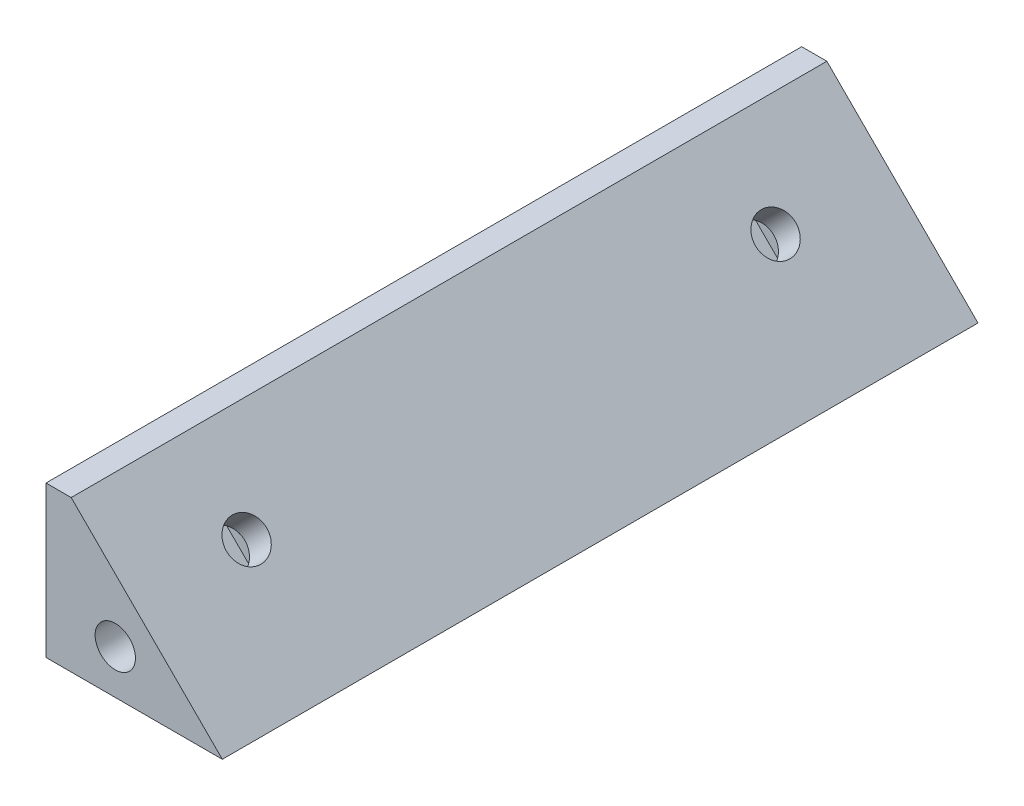
ISO-10303-21;
HEADER;
FILE_DESCRIPTION(('STEP AP214'),'2;1');
FILE_NAME('part.step','',(''),(''),'','','');
FILE_SCHEMA(('AUTOMOTIVE_DESIGN { 1 0 10303 214 1 1 1 1 }'));
ENDSEC;
DATA;
#1=APPLICATION_CONTEXT('core data for automotive mechanical design processes');
#2=APPLICATION_PROTOCOL_DEFINITION('international standard','automotive_design',2000,#1);
#3=PRODUCT_CONTEXT('',#1,'mechanical');
#4=PRODUCT('Part','Part','',(#3));
#5=PRODUCT_RELATED_PRODUCT_CATEGORY('part','',(#4));
#6=PRODUCT_DEFINITION_FORMATION('','',#4);
#7=PRODUCT_DEFINITION_CONTEXT('part definition',#1,'design');
#8=PRODUCT_DEFINITION('design','',#6,#7);
#9=PRODUCT_DEFINITION_SHAPE('','',#8);
#10=(LENGTH_UNIT() NAMED_UNIT(*) SI_UNIT(.MILLI.,.METRE.));
#11=(NAMED_UNIT(*) PLANE_ANGLE_UNIT() SI_UNIT($,.RADIAN.));
#12=(NAMED_UNIT(*) SI_UNIT($,.STERADIAN.) SOLID_ANGLE_UNIT());
#13=UNCERTAINTY_MEASURE_WITH_UNIT(LENGTH_MEASURE(1.E-05),#10,'distance_accuracy_value','');
#14=(GEOMETRIC_REPRESENTATION_CONTEXT(3) GLOBAL_UNCERTAINTY_ASSIGNED_CONTEXT((#13)) GLOBAL_UNIT_ASSIGNED_CONTEXT((#10,
#11,#12)) REPRESENTATION_CONTEXT('',''));
#15=CARTESIAN_POINT('',(0.,0.,0.));
#16=DIRECTION('',(0.,0.,1.));
#17=DIRECTION('',(1.,0.,0.));
#18=AXIS2_PLACEMENT_3D('',#15,#16,#17);
#19=CARTESIAN_POINT('',(4.26758838609296,4.26758838609296,0.));
#20=DIRECTION('',(0.707106781186548,0.707106781186547,0.));
#21=DIRECTION('',(-0.707106781186547,0.707106781186548,0.));
#22=AXIS2_PLACEMENT_3D('',#19,#20,#21);
#23=PLANE('',#22);
#24=CARTESIAN_POINT('',(3.19652057422748,5.33865619795844,9.));
#25=DIRECTION('',(0.707106781186548,0.707106781186547,0.));
#26=DIRECTION('',(-0.707106781186547,0.707106781186548,0.));
#27=AXIS2_PLACEMENT_3D('',#24,#25,#26);
#28=CIRCLE('',#27,1.6);
#29=CARTESIAN_POINT('',(2.06514972432901,6.47002704785692,9.));
#30=VERTEX_POINT('',#29);
#31=EDGE_CURVE('E362',#30,#30,#28,.T.);
#32=ORIENTED_EDGE('',*,*,#31,.T.);
#33=EDGE_LOOP('',(#32));
#34=FACE_BOUND('',#33,.T.);
#35=DIRECTION('',(-0.707106781186547,0.707106781186548,0.));
#36=VECTOR('',#35,1.);
#37=CARTESIAN_POINT('',(4.26758838609296,4.26758838609296,6.175));
#38=LINE('',#37,#36);
#39=CARTESIAN_POINT('',(8.53517677218592,0.,6.175));
#40=VERTEX_POINT('',#39);
#41=CARTESIAN_POINT('',(2.04321915366707,6.49195761851885,6.175));
#42=VERTEX_POINT('',#41);
#43=EDGE_CURVE('E373',#40,#42,#38,.T.);
#44=ORIENTED_EDGE('',*,*,#43,.F.);
#45=DIRECTION('',(0.,0.,1.));
#46=VECTOR('',#45,1.);
#47=CARTESIAN_POINT('',(8.53517677218592,0.,0.));
#48=LINE('',#47,#46);
#49=CARTESIAN_POINT('',(8.53517677218592,0.,11.825));
#50=VERTEX_POINT('',#49);
#51=EDGE_CURVE('E613',#40,#50,#48,.T.);
#52=ORIENTED_EDGE('',*,*,#51,.T.);
#53=DIRECTION('',(-0.707106781186547,0.707106781186548,0.));
#54=VECTOR('',#53,1.);
#55=CARTESIAN_POINT('',(4.26758838609296,4.26758838609296,11.825));
#56=LINE('',#55,#54);
#57=CARTESIAN_POINT('',(2.04321915366707,6.49195761851886,11.825));
#58=VERTEX_POINT('',#57);
#59=EDGE_CURVE('E370',#50,#58,#56,.T.);
#60=ORIENTED_EDGE('',*,*,#59,.T.);
#61=DIRECTION('',(-0.353553390593274,0.353553390593274,-0.866025403784439));
#62=VECTOR('',#61,1.);
#63=CARTESIAN_POINT('',(-1.02134056427785,9.55651733646377,4.31839240474743));
#64=LINE('',#63,#62);
#65=CARTESIAN_POINT('',(0.889917733106655,7.64525903907927,9.00000000000001));
#66=VERTEX_POINT('',#65);
#67=EDGE_CURVE('E365',#58,#66,#64,.T.);
#68=ORIENTED_EDGE('',*,*,#67,.T.);
#69=DIRECTION('',(0.353553390593273,-0.353553390593274,-0.866025403784439));
#70=VECTOR('',#69,1.);
#71=CARTESIAN_POINT('',(4.49001135698431,4.04516541520162,0.181607595252568));
#72=LINE('',#71,#70);
#73=EDGE_CURVE('E417',#66,#42,#72,.T.);
#74=ORIENTED_EDGE('',*,*,#73,.T.);
#75=EDGE_LOOP('',(#44,#52,#60,#68,#74));
#76=FACE_BOUND('',#75,.T.);
#77=ADVANCED_FACE('F124',(#34,#76),#23,.F.);
#78=CARTESIAN_POINT('',(0.,0.,30.));
#79=DIRECTION('',(0.,1.,0.));
#80=DIRECTION('',(0.,0.,1.));
#81=AXIS2_PLACEMENT_3D('',#78,#79,#80);
#82=PLANE('',#81);
#83=DIRECTION('',(0.,0.,-1.));
#84=VECTOR('',#83,1.);
#85=CARTESIAN_POINT('',(10.6693372220188,0.,5.));
#86=LINE('',#85,#84);
#87=CARTESIAN_POINT('',(10.6693372220189,0.,5.));
#88=VERTEX_POINT('',#87);
#89=CARTESIAN_POINT('',(10.6693372220188,0.,2.45));
#90=VERTEX_POINT('',#89);
#91=EDGE_CURVE('E355',#88,#90,#86,.T.);
#92=ORIENTED_EDGE('',*,*,#91,.T.);
#93=DIRECTION('',(1.,0.,0.));
#94=VECTOR('',#93,1.);
#95=CARTESIAN_POINT('',(0.,0.,2.45));
#96=LINE('',#95,#94);
#97=CARTESIAN_POINT('',(2.91347758001106,0.,2.45));
#98=VERTEX_POINT('',#97);
#99=EDGE_CURVE('E325',#98,#90,#96,.T.);
#100=ORIENTED_EDGE('',*,*,#99,.F.);
#101=DIRECTION('',(0.,0.,-1.));
#102=VECTOR('',#101,1.);
#103=CARTESIAN_POINT('',(2.91347758001106,0.,5.));
#104=LINE('',#103,#102);
#105=CARTESIAN_POINT('',(2.91347758001106,0.,5.));
#106=VERTEX_POINT('',#105);
#107=EDGE_CURVE('E358',#106,#98,#104,.T.);
#108=ORIENTED_EDGE('',*,*,#107,.F.);
#109=DIRECTION('',(1.,0.,0.));
#110=VECTOR('',#109,1.);
#111=CARTESIAN_POINT('',(0.,0.,5.));
#112=LINE('',#111,#110);
#113=EDGE_CURVE('E338',#106,#88,#112,.T.);
#114=ORIENTED_EDGE('',*,*,#113,.T.);
#115=EDGE_LOOP('',(#92,#100,#108,#114));
#116=FACE_BOUND('',#115,.T.);
#117=DIRECTION('',(1.,0.,0.));
#118=VECTOR('',#117,1.);
#119=CARTESIAN_POINT('',(0.,0.,0.));
#120=LINE('',#119,#118);
#121=CARTESIAN_POINT('',(-2.,0.,0.));
#122=VERTEX_POINT('',#121);
#123=CARTESIAN_POINT('',(12.,0.,0.));
#124=VERTEX_POINT('',#123);
#125=EDGE_CURVE('E305',#122,#124,#120,.T.);
#126=ORIENTED_EDGE('',*,*,#125,.T.);
#127=DIRECTION('',(0.,0.,-1.));
#128=VECTOR('',#127,1.);
#129=CARTESIAN_POINT('',(12.,0.,30.));
#130=LINE('',#129,#128);
#131=CARTESIAN_POINT('',(12.,0.,60.));
#132=VERTEX_POINT('',#131);
#133=EDGE_CURVE('E303',#132,#124,#130,.T.);
#134=ORIENTED_EDGE('',*,*,#133,.F.);
#135=DIRECTION('',(1.,0.,0.));
#136=VECTOR('',#135,1.);
#137=CARTESIAN_POINT('',(0.,0.,60.));
#138=LINE('',#137,#136);
#139=CARTESIAN_POINT('',(-2.,0.,60.));
#140=VERTEX_POINT('',#139);
#141=EDGE_CURVE('E288',#140,#132,#138,.T.);
#142=ORIENTED_EDGE('',*,*,#141,.F.);
#143=DIRECTION('',(0.,0.,-1.));
#144=VECTOR('',#143,1.);
#145=CARTESIAN_POINT('',(-2.,0.,30.));
#146=LINE('',#145,#144);
#147=EDGE_CURVE('E402',#140,#122,#146,.T.);
#148=ORIENTED_EDGE('',*,*,#147,.T.);
#149=EDGE_LOOP('',(#126,#134,#142,#148));
#150=FACE_BOUND('',#149,.T.);
#151=DIRECTION('',(1.,0.,0.));
#152=VECTOR('',#151,1.);
#153=CARTESIAN_POINT('',(0.,0.,11.825));
#154=LINE('',#153,#152);
#155=CARTESIAN_POINT('',(4.92893218813453,0.,11.825));
#156=VERTEX_POINT('',#155);
#157=EDGE_CURVE('E391',#156,#50,#154,.T.);
#158=ORIENTED_EDGE('',*,*,#157,.T.);
#159=ORIENTED_EDGE('',*,*,#51,.F.);
#160=DIRECTION('',(1.,0.,0.));
#161=VECTOR('',#160,1.);
#162=CARTESIAN_POINT('',(0.,0.,6.175));
#163=LINE('',#162,#161);
#164=CARTESIAN_POINT('',(4.92893218813453,0.,6.175));
#165=VERTEX_POINT('',#164);
#166=EDGE_CURVE('E399',#165,#40,#163,.T.);
#167=ORIENTED_EDGE('',*,*,#166,.F.);
#168=DIRECTION('',(0.,0.,-1.));
#169=VECTOR('',#168,1.);
#170=CARTESIAN_POINT('',(4.92893218813453,0.,30.));
#171=LINE('',#170,#169);
#172=EDGE_CURVE('E309',#156,#165,#171,.T.);
#173=ORIENTED_EDGE('',*,*,#172,.F.);
#174=EDGE_LOOP('',(#158,#159,#167,#173));
#175=FACE_BOUND('',#174,.T.);
#176=DIRECTION('',(1.,0.,0.));
#177=VECTOR('',#176,1.);
#178=CARTESIAN_POINT('',(0.,0.,53.825));
#179=LINE('',#178,#177);
#180=CARTESIAN_POINT('',(4.92893218813453,0.,53.825));
#181=VERTEX_POINT('',#180);
#182=CARTESIAN_POINT('',(8.53517677218592,0.,53.825));
#183=VERTEX_POINT('',#182);
#184=EDGE_CURVE('E446',#181,#183,#179,.T.);
#185=ORIENTED_EDGE('',*,*,#184,.T.);
#186=CARTESIAN_POINT('',(8.53517677218592,0.,48.175));
#187=VERTEX_POINT('',#186);
#188=EDGE_CURVE('E444',#187,#183,#48,.T.);
#189=ORIENTED_EDGE('',*,*,#188,.F.);
#190=DIRECTION('',(1.,0.,0.));
#191=VECTOR('',#190,1.);
#192=CARTESIAN_POINT('',(0.,0.,48.175));
#193=LINE('',#192,#191);
#194=CARTESIAN_POINT('',(4.92893218813453,0.,48.175));
#195=VERTEX_POINT('',#194);
#196=EDGE_CURVE('E438',#195,#187,#193,.T.);
#197=ORIENTED_EDGE('',*,*,#196,.F.);
#198=DIRECTION('',(0.,0.,-1.));
#199=VECTOR('',#198,1.);
#200=CARTESIAN_POINT('',(4.92893218813453,0.,30.));
#201=LINE('',#200,#199);
#202=EDGE_CURVE('E132',#181,#195,#201,.T.);
#203=ORIENTED_EDGE('',*,*,#202,.F.);
#204=EDGE_LOOP('',(#185,#189,#197,#203));
#205=FACE_BOUND('',#204,.T.);
#206=DIRECTION('',(1.,0.,0.));
#207=VECTOR('',#206,1.);
#208=CARTESIAN_POINT('',(0.,0.,55.));
#209=LINE('',#208,#207);
#210=CARTESIAN_POINT('',(2.91347758001106,0.,55.));
#211=VERTEX_POINT('',#210);
#212=CARTESIAN_POINT('',(10.6693372220189,0.,55.));
#213=VERTEX_POINT('',#212);
#214=EDGE_CURVE('E625',#211,#213,#209,.T.);
#215=ORIENTED_EDGE('',*,*,#214,.F.);
#216=DIRECTION('',(0.,0.,1.));
#217=VECTOR('',#216,1.);
#218=CARTESIAN_POINT('',(2.91347758001106,0.,55.));
#219=LINE('',#218,#217);
#220=CARTESIAN_POINT('',(2.91347758001106,0.,57.55));
#221=VERTEX_POINT('',#220);
#222=EDGE_CURVE('E628',#211,#221,#219,.T.);
#223=ORIENTED_EDGE('',*,*,#222,.T.);
#224=DIRECTION('',(1.,0.,0.));
#225=VECTOR('',#224,1.);
#226=CARTESIAN_POINT('',(0.,0.,57.55));
#227=LINE('',#226,#225);
#228=CARTESIAN_POINT('',(10.6693372220188,0.,57.55));
#229=VERTEX_POINT('',#228);
#230=EDGE_CURVE('E598',#221,#229,#227,.T.);
#231=ORIENTED_EDGE('',*,*,#230,.T.);
#232=DIRECTION('',(0.,0.,1.));
#233=VECTOR('',#232,1.);
#234=CARTESIAN_POINT('',(10.6693372220188,0.,55.));
#235=LINE('',#234,#233);
#236=EDGE_CURVE('E630',#213,#229,#235,.T.);
#237=ORIENTED_EDGE('',*,*,#236,.F.);
#238=EDGE_LOOP('',(#215,#223,#231,#237));
#239=FACE_BOUND('',#238,.T.);
#240=ADVANCED_FACE('F126',(#116,#150,#175,#205,#239),#82,.F.);
#241=CARTESIAN_POINT('',(2.46446609406727,2.46446609406727,53.825));
#242=DIRECTION('',(0.,0.,1.));
#243=DIRECTION('',(0.,-1.,0.));
#244=AXIS2_PLACEMENT_3D('',#241,#242,#243);
#245=PLANE('',#244);
#246=DIRECTION('',(-0.707106781186547,0.707106781186548,0.));
#247=VECTOR('',#246,1.);
#248=CARTESIAN_POINT('',(4.26758838609296,4.26758838609296,53.825));
#249=LINE('',#248,#247);
#250=CARTESIAN_POINT('',(2.04321915366707,6.49195761851885,53.825));
#251=VERTEX_POINT('',#250);
#252=EDGE_CURVE('E527',#183,#251,#249,.T.);
#253=ORIENTED_EDGE('',*,*,#252,.F.);
#254=ORIENTED_EDGE('',*,*,#184,.F.);
#255=DIRECTION('',(0.707106781186547,-0.707106781186548,0.));
#256=VECTOR('',#255,1.);
#257=CARTESIAN_POINT('',(2.46446609406727,2.46446609406727,53.825));
#258=LINE('',#257,#256);
#259=CARTESIAN_POINT('',(0.240096861641371,4.68883532649316,53.825));
#260=VERTEX_POINT('',#259);
#261=EDGE_CURVE('E429',#260,#181,#258,.T.);
#262=ORIENTED_EDGE('',*,*,#261,.F.);
#263=DIRECTION('',(0.707106781186548,0.707106781186547,0.));
#264=VECTOR('',#263,1.);
#265=CARTESIAN_POINT('',(0.240096861641371,4.68883532649316,53.825));
#266=LINE('',#265,#264);
#267=EDGE_CURVE('E447',#260,#251,#266,.T.);
#268=ORIENTED_EDGE('',*,*,#267,.T.);
#269=EDGE_LOOP('',(#253,#254,#262,#268));
#270=FACE_BOUND('',#269,.T.);
#271=ADVANCED_FACE('F492',(#270),#245,.F.);
#272=CARTESIAN_POINT('',(2.46446609406727,2.46446609406727,48.175));
#273=DIRECTION('',(0.,0.,1.));
#274=DIRECTION('',(1.,0.,0.));
#275=AXIS2_PLACEMENT_3D('',#272,#273,#274);
#276=PLANE('',#275);
#277=ORIENTED_EDGE('',*,*,#196,.T.);
#278=DIRECTION('',(-0.707106781186547,0.707106781186548,0.));
#279=VECTOR('',#278,1.);
#280=CARTESIAN_POINT('',(4.26758838609296,4.26758838609296,48.175));
#281=LINE('',#280,#279);
#282=CARTESIAN_POINT('',(2.04321915366707,6.49195761851886,48.175));
#283=VERTEX_POINT('',#282);
#284=EDGE_CURVE('E510',#187,#283,#281,.T.);
#285=ORIENTED_EDGE('',*,*,#284,.T.);
#286=DIRECTION('',(0.707106781186548,0.707106781186547,0.));
#287=VECTOR('',#286,1.);
#288=CARTESIAN_POINT('',(0.240096861641371,4.68883532649316,48.175));
#289=LINE('',#288,#287);
#290=CARTESIAN_POINT('',(0.240096861641371,4.68883532649316,48.175));
#291=VERTEX_POINT('',#290);
#292=EDGE_CURVE('E440',#291,#283,#289,.T.);
#293=ORIENTED_EDGE('',*,*,#292,.F.);
#294=DIRECTION('',(0.707106781186547,-0.707106781186548,0.));
#295=VECTOR('',#294,1.);
#296=CARTESIAN_POINT('',(2.46446609406727,2.46446609406727,48.175));
#297=LINE('',#296,#295);
#298=EDGE_CURVE('E426',#291,#195,#297,.T.);
#299=ORIENTED_EDGE('',*,*,#298,.T.);
#300=EDGE_LOOP('',(#277,#285,#293,#299));
#301=FACE_BOUND('',#300,.T.);
#302=ADVANCED_FACE('F436',(#301),#276,.T.);
#303=CARTESIAN_POINT('',(2.68688906495861,2.24204312317592,59.8183924047474));
#304=DIRECTION('',(0.612372435695795,-0.612372435695795,-0.5));
#305=DIRECTION('',(0.707106781186548,0.707106781186547,0.));
#306=AXIS2_PLACEMENT_3D('',#303,#304,#305);
#307=PLANE('',#306);
#308=DIRECTION('',(0.707106781186548,0.707106781186547,0.));
#309=VECTOR('',#308,1.);
#310=CARTESIAN_POINT('',(-0.913204558919042,5.84213674705358,51.));
#311=LINE('',#310,#309);
#312=CARTESIAN_POINT('',(-0.913204558919042,5.84213674705358,51.));
#313=VERTEX_POINT('',#312);
#314=CARTESIAN_POINT('',(0.889917733106652,7.64525903907927,51.));
#315=VERTEX_POINT('',#314);
#316=EDGE_CURVE('E451',#313,#315,#311,.T.);
#317=ORIENTED_EDGE('',*,*,#316,.T.);
#318=DIRECTION('',(0.353553390593273,-0.353553390593274,0.866025403784439));
#319=VECTOR('',#318,1.);
#320=CARTESIAN_POINT('',(4.49001135698431,4.04516541520162,59.8183924047474));
#321=LINE('',#320,#319);
#322=EDGE_CURVE('E515',#315,#251,#321,.T.);
#323=ORIENTED_EDGE('',*,*,#322,.T.);
#324=ORIENTED_EDGE('',*,*,#267,.F.);
#325=DIRECTION('',(-0.353553390593273,0.353553390593274,-0.866025403784439));
#326=VECTOR('',#325,1.);
#327=CARTESIAN_POINT('',(2.68688906495861,2.24204312317592,59.8183924047474));
#328=LINE('',#327,#326);
#329=EDGE_CURVE('E531',#260,#313,#328,.T.);
#330=ORIENTED_EDGE('',*,*,#329,.T.);
#331=EDGE_LOOP('',(#317,#323,#324,#330));
#332=FACE_BOUND('',#331,.T.);
#333=ADVANCED_FACE('F538',(#332),#307,.T.);
#334=CARTESIAN_POINT('',(-2.82446285630354,7.75339504443808,55.6816075952526));
#335=DIRECTION('',(0.612372435695794,-0.612372435695795,0.5));
#336=DIRECTION('',(0.707106781186548,0.707106781186547,0.));
#337=AXIS2_PLACEMENT_3D('',#334,#335,#336);
#338=PLANE('',#337);
#339=ORIENTED_EDGE('',*,*,#292,.T.);
#340=DIRECTION('',(-0.353553390593274,0.353553390593274,0.866025403784439));
#341=VECTOR('',#340,1.);
#342=CARTESIAN_POINT('',(-1.02134056427785,9.55651733646377,55.6816075952526));
#343=LINE('',#342,#341);
#344=EDGE_CURVE('E12',#283,#315,#343,.T.);
#345=ORIENTED_EDGE('',*,*,#344,.T.);
#346=ORIENTED_EDGE('',*,*,#316,.F.);
#347=DIRECTION('',(0.353553390593274,-0.353553390593274,-0.866025403784439));
#348=VECTOR('',#347,1.);
#349=CARTESIAN_POINT('',(-2.82446285630354,7.75339504443808,55.6816075952526));
#350=LINE('',#349,#348);
#351=EDGE_CURVE('E441',#313,#291,#350,.T.);
#352=ORIENTED_EDGE('',*,*,#351,.T.);
#353=EDGE_LOOP('',(#339,#345,#346,#352));
#354=FACE_BOUND('',#353,.T.);
#355=ADVANCED_FACE('F466',(#354),#338,.T.);
#356=CARTESIAN_POINT('',(0.,0.,0.));
#357=DIRECTION('',(0.,0.,1.));
#358=DIRECTION('',(1.,0.,0.));
#359=AXIS2_PLACEMENT_3D('',#356,#357,#358);
#360=PLANE('',#359);
#361=DIRECTION('',(0.707106781186548,-0.707106781186548,0.));
#362=VECTOR('',#361,1.);
#363=CARTESIAN_POINT('',(6.,6.,0.));
#364=LINE('',#363,#362);
#365=CARTESIAN_POINT('',(0.,12.,0.));
#366=VERTEX_POINT('',#365);
#367=EDGE_CURVE('E413',#366,#124,#364,.T.);
#368=ORIENTED_EDGE('',*,*,#367,.T.);
#369=ORIENTED_EDGE('',*,*,#125,.F.);
#370=DIRECTION('',(0.,1.,0.));
#371=VECTOR('',#370,1.);
#372=CARTESIAN_POINT('',(-2.,0.,0.));
#373=LINE('',#372,#371);
#374=CARTESIAN_POINT('',(-2.,12.,0.));
#375=VERTEX_POINT('',#374);
#376=EDGE_CURVE('E403',#122,#375,#373,.T.);
#377=ORIENTED_EDGE('',*,*,#376,.T.);
#378=DIRECTION('',(-1.,0.,0.));
#379=VECTOR('',#378,1.);
#380=CARTESIAN_POINT('',(0.,12.,0.));
#381=LINE('',#380,#379);
#382=EDGE_CURVE('E406',#366,#375,#381,.T.);
#383=ORIENTED_EDGE('',*,*,#382,.F.);
#384=EDGE_LOOP('',(#368,#369,#377,#383));
#385=FACE_BOUND('',#384,.T.);
#386=CARTESIAN_POINT('',(3.5,3.5,0.));
#387=DIRECTION('',(0.,0.,1.));
#388=DIRECTION('',(1.,0.,0.));
#389=AXIS2_PLACEMENT_3D('',#386,#387,#388);
#390=CIRCLE('',#389,1.6);
#391=CARTESIAN_POINT('',(5.1,3.5,0.));
#392=VERTEX_POINT('',#391);
#393=EDGE_CURVE('E300',#392,#392,#390,.T.);
#394=ORIENTED_EDGE('',*,*,#393,.T.);
#395=EDGE_LOOP('',(#394));
#396=FACE_BOUND('',#395,.T.);
#397=ADVANCED_FACE('F462',(#385,#396),#360,.F.);
#398=CARTESIAN_POINT('',(2.46446609406727,2.46446609406727,6.175));
#399=DIRECTION('',(0.,0.,1.));
#400=DIRECTION('',(0.,-1.,0.));
#401=AXIS2_PLACEMENT_3D('',#398,#399,#400);
#402=PLANE('',#401);
#403=ORIENTED_EDGE('',*,*,#166,.T.);
#404=ORIENTED_EDGE('',*,*,#43,.T.);
#405=DIRECTION('',(0.707106781186548,0.707106781186547,0.));
#406=VECTOR('',#405,1.);
#407=CARTESIAN_POINT('',(0.240096861641371,4.68883532649316,6.175));
#408=LINE('',#407,#406);
#409=CARTESIAN_POINT('',(0.240096861641371,4.68883532649316,6.175));
#410=VERTEX_POINT('',#409);
#411=EDGE_CURVE('E387',#410,#42,#408,.T.);
#412=ORIENTED_EDGE('',*,*,#411,.F.);
#413=DIRECTION('',(0.707106781186547,-0.707106781186548,0.));
#414=VECTOR('',#413,1.);
#415=CARTESIAN_POINT('',(2.46446609406727,2.46446609406727,6.175));
#416=LINE('',#415,#414);
#417=EDGE_CURVE('E375',#410,#165,#416,.T.);
#418=ORIENTED_EDGE('',*,*,#417,.T.);
#419=EDGE_LOOP('',(#403,#404,#412,#418));
#420=FACE_BOUND('',#419,.T.);
#421=ADVANCED_FACE('F465',(#420),#402,.T.);
#422=CARTESIAN_POINT('',(2.46446609406727,2.46446609406727,11.825));
#423=DIRECTION('',(0.,0.,1.));
#424=DIRECTION('',(1.,0.,0.));
#425=AXIS2_PLACEMENT_3D('',#422,#423,#424);
#426=PLANE('',#425);
#427=ORIENTED_EDGE('',*,*,#59,.F.);
#428=ORIENTED_EDGE('',*,*,#157,.F.);
#429=DIRECTION('',(0.707106781186547,-0.707106781186548,0.));
#430=VECTOR('',#429,1.);
#431=CARTESIAN_POINT('',(2.46446609406727,2.46446609406727,11.825));
#432=LINE('',#431,#430);
#433=CARTESIAN_POINT('',(0.240096861641371,4.68883532649316,11.825));
#434=VERTEX_POINT('',#433);
#435=EDGE_CURVE('E384',#434,#156,#432,.T.);
#436=ORIENTED_EDGE('',*,*,#435,.F.);
#437=DIRECTION('',(0.707106781186548,0.707106781186547,0.));
#438=VECTOR('',#437,1.);
#439=CARTESIAN_POINT('',(0.240096861641371,4.68883532649316,11.825));
#440=LINE('',#439,#438);
#441=EDGE_CURVE('E388',#434,#58,#440,.T.);
#442=ORIENTED_EDGE('',*,*,#441,.T.);
#443=EDGE_LOOP('',(#427,#428,#436,#442));
#444=FACE_BOUND('',#443,.T.);
#445=ADVANCED_FACE('F646',(#444),#426,.F.);
#446=CARTESIAN_POINT('',(-2.82446285630354,7.75339504443808,4.31839240474743));
#447=DIRECTION('',(-0.612372435695794,0.612372435695795,0.5));
#448=DIRECTION('',(-0.707106781186548,-0.707106781186547,0.));
#449=AXIS2_PLACEMENT_3D('',#446,#447,#448);
#450=PLANE('',#449);
#451=ORIENTED_EDGE('',*,*,#67,.F.);
#452=ORIENTED_EDGE('',*,*,#441,.F.);
#453=DIRECTION('',(0.353553390593274,-0.353553390593274,0.866025403784439));
#454=VECTOR('',#453,1.);
#455=CARTESIAN_POINT('',(-2.82446285630354,7.75339504443808,4.31839240474743));
#456=LINE('',#455,#454);
#457=CARTESIAN_POINT('',(-0.913204558919042,5.84213674705358,9.));
#458=VERTEX_POINT('',#457);
#459=EDGE_CURVE('E381',#458,#434,#456,.T.);
#460=ORIENTED_EDGE('',*,*,#459,.F.);
#461=DIRECTION('',(0.707106781186548,0.707106781186547,0.));
#462=VECTOR('',#461,1.);
#463=CARTESIAN_POINT('',(-0.913204558919042,5.84213674705358,9.));
#464=LINE('',#463,#462);
#465=EDGE_CURVE('E392',#458,#66,#464,.T.);
#466=ORIENTED_EDGE('',*,*,#465,.T.);
#467=EDGE_LOOP('',(#451,#452,#460,#466));
#468=FACE_BOUND('',#467,.T.);
#469=ADVANCED_FACE('F655',(#468),#450,.F.);
#470=CARTESIAN_POINT('',(2.68688906495861,2.24204312317592,0.181607595252568));
#471=DIRECTION('',(-0.612372435695795,0.612372435695795,-0.5));
#472=DIRECTION('',(-0.707106781186548,-0.707106781186547,0.));
#473=AXIS2_PLACEMENT_3D('',#470,#471,#472);
#474=PLANE('',#473);
#475=ORIENTED_EDGE('',*,*,#73,.F.);
#476=ORIENTED_EDGE('',*,*,#465,.F.);
#477=DIRECTION('',(-0.353553390593273,0.353553390593274,0.866025403784439));
#478=VECTOR('',#477,1.);
#479=CARTESIAN_POINT('',(2.68688906495861,2.24204312317592,0.181607595252568));
#480=LINE('',#479,#478);
#481=EDGE_CURVE('E378',#410,#458,#480,.T.);
#482=ORIENTED_EDGE('',*,*,#481,.F.);
#483=ORIENTED_EDGE('',*,*,#411,.T.);
#484=EDGE_LOOP('',(#475,#476,#482,#483));
#485=FACE_BOUND('',#484,.T.);
#486=ADVANCED_FACE('F653',(#485),#474,.F.);
#487=CARTESIAN_POINT('',(6.,6.,30.));
#488=DIRECTION('',(0.707106781186547,0.707106781186547,0.));
#489=DIRECTION('',(-0.707106781186548,0.707106781186548,0.));
#490=AXIS2_PLACEMENT_3D('',#487,#488,#489);
#491=PLANE('',#490);
#492=DIRECTION('',(0.707106781186548,-0.707106781186548,0.));
#493=VECTOR('',#492,1.);
#494=CARTESIAN_POINT('',(6.,6.,60.));
#495=LINE('',#494,#493);
#496=CARTESIAN_POINT('',(0.,12.,60.));
#497=VERTEX_POINT('',#496);
#498=EDGE_CURVE('E294',#497,#132,#495,.T.);
#499=ORIENTED_EDGE('',*,*,#498,.T.);
#500=ORIENTED_EDGE('',*,*,#133,.T.);
#501=ORIENTED_EDGE('',*,*,#367,.F.);
#502=DIRECTION('',(0.,0.,-1.));
#503=VECTOR('',#502,1.);
#504=CARTESIAN_POINT('',(0.,12.,30.));
#505=LINE('',#504,#503);
#506=EDGE_CURVE('E310',#497,#366,#505,.T.);
#507=ORIENTED_EDGE('',*,*,#506,.F.);
#508=EDGE_LOOP('',(#499,#500,#501,#507));
#509=FACE_BOUND('',#508,.T.);
#510=CARTESIAN_POINT('',(4.92893218813452,7.07106781186548,51.));
#511=DIRECTION('',(-0.707106781186548,-0.707106781186547,0.));
#512=DIRECTION('',(-0.707106781186547,0.707106781186548,0.));
#513=AXIS2_PLACEMENT_3D('',#510,#511,#512);
#514=CIRCLE('',#513,1.6);
#515=CARTESIAN_POINT('',(3.79756133823605,8.20243866176396,51.));
#516=VERTEX_POINT('',#515);
#517=EDGE_CURVE('E516',#516,#516,#514,.T.);
#518=ORIENTED_EDGE('',*,*,#517,.T.);
#519=EDGE_LOOP('',(#518));
#520=FACE_BOUND('',#519,.T.);
#521=CARTESIAN_POINT('',(4.92893218813452,7.07106781186548,9.));
#522=DIRECTION('',(0.707106781186548,0.707106781186547,0.));
#523=DIRECTION('',(-0.707106781186547,0.707106781186548,0.));
#524=AXIS2_PLACEMENT_3D('',#521,#522,#523);
#525=CIRCLE('',#524,1.6);
#526=CARTESIAN_POINT('',(3.79756133823605,8.20243866176396,9.));
#527=VERTEX_POINT('',#526);
#528=EDGE_CURVE('E361',#527,#527,#525,.T.);
#529=ORIENTED_EDGE('',*,*,#528,.F.);
#530=EDGE_LOOP('',(#529));
#531=FACE_BOUND('',#530,.T.);
#532=ADVANCED_FACE('F312',(#509,#520,#531),#491,.T.);
#533=CARTESIAN_POINT('',(-2.,0.,30.));
#534=DIRECTION('',(-1.,0.,0.));
#535=DIRECTION('',(0.,-1.,0.));
#536=AXIS2_PLACEMENT_3D('',#533,#534,#535);
#537=PLANE('',#536);
#538=ORIENTED_EDGE('',*,*,#376,.F.);
#539=ORIENTED_EDGE('',*,*,#147,.F.);
#540=DIRECTION('',(0.,1.,0.));
#541=VECTOR('',#540,1.);
#542=CARTESIAN_POINT('',(-2.,0.,60.));
#543=LINE('',#542,#541);
#544=CARTESIAN_POINT('',(-2.,12.,60.));
#545=VERTEX_POINT('',#544);
#546=EDGE_CURVE('E297',#140,#545,#543,.T.);
#547=ORIENTED_EDGE('',*,*,#546,.T.);
#548=DIRECTION('',(0.,0.,-1.));
#549=VECTOR('',#548,1.);
#550=CARTESIAN_POINT('',(-2.,12.,30.));
#551=LINE('',#550,#549);
#552=EDGE_CURVE('E409',#545,#375,#551,.T.);
#553=ORIENTED_EDGE('',*,*,#552,.T.);
#554=EDGE_LOOP('',(#538,#539,#547,#553));
#555=FACE_BOUND('',#554,.T.);
#556=ADVANCED_FACE('F457',(#555),#537,.T.);
#557=CARTESIAN_POINT('',(0.,12.,30.));
#558=DIRECTION('',(0.,-1.,0.));
#559=DIRECTION('',(0.,0.,-1.));
#560=AXIS2_PLACEMENT_3D('',#557,#558,#559);
#561=PLANE('',#560);
#562=ORIENTED_EDGE('',*,*,#382,.T.);
#563=ORIENTED_EDGE('',*,*,#552,.F.);
#564=DIRECTION('',(-1.,0.,0.));
#565=VECTOR('',#564,1.);
#566=CARTESIAN_POINT('',(0.,12.,60.));
#567=LINE('',#566,#565);
#568=EDGE_CURVE('E314',#497,#545,#567,.T.);
#569=ORIENTED_EDGE('',*,*,#568,.F.);
#570=ORIENTED_EDGE('',*,*,#506,.T.);
#571=EDGE_LOOP('',(#562,#563,#569,#570));
#572=FACE_BOUND('',#571,.T.);
#573=ADVANCED_FACE('F459',(#572),#561,.F.);
#574=CARTESIAN_POINT('',(2.46446609406727,2.46446609406727,0.));
#575=DIRECTION('',(0.707106781186548,0.707106781186547,0.));
#576=DIRECTION('',(-0.707106781186547,0.707106781186548,0.));
#577=AXIS2_PLACEMENT_3D('',#574,#575,#576);
#578=PLANE('',#577);
#579=ORIENTED_EDGE('',*,*,#172,.T.);
#580=ORIENTED_EDGE('',*,*,#417,.F.);
#581=ORIENTED_EDGE('',*,*,#481,.T.);
#582=ORIENTED_EDGE('',*,*,#459,.T.);
#583=ORIENTED_EDGE('',*,*,#435,.T.);
#584=EDGE_LOOP('',(#579,#580,#581,#582,#583));
#585=FACE_BOUND('',#584,.T.);
#586=ADVANCED_FACE('F499',(#585),#578,.T.);
#587=ORIENTED_EDGE('',*,*,#284,.F.);
#588=ORIENTED_EDGE('',*,*,#188,.T.);
#589=ORIENTED_EDGE('',*,*,#252,.T.);
#590=ORIENTED_EDGE('',*,*,#322,.F.);
#591=ORIENTED_EDGE('',*,*,#344,.F.);
#592=EDGE_LOOP('',(#587,#588,#589,#590,#591));
#593=FACE_BOUND('',#592,.T.);
#594=CARTESIAN_POINT('',(3.19652057422748,5.33865619795844,51.));
#595=DIRECTION('',(-0.707106781186548,-0.707106781186547,0.));
#596=DIRECTION('',(-0.707106781186547,0.707106781186548,0.));
#597=AXIS2_PLACEMENT_3D('',#594,#595,#596);
#598=CIRCLE('',#597,1.6);
#599=CARTESIAN_POINT('',(2.06514972432901,6.47002704785692,51.));
#600=VERTEX_POINT('',#599);
#601=EDGE_CURVE('E513',#600,#600,#598,.T.);
#602=ORIENTED_EDGE('',*,*,#601,.F.);
#603=EDGE_LOOP('',(#602));
#604=FACE_BOUND('',#603,.T.);
#605=ADVANCED_FACE('F488',(#593,#604),#23,.F.);
#606=CARTESIAN_POINT('',(3.19652057422748,5.33865619795844,9.));
#607=DIRECTION('',(0.707106781186548,0.707106781186548,0.));
#608=DIRECTION('',(-0.707106781186547,0.707106781186548,0.));
#609=AXIS2_PLACEMENT_3D('',#606,#607,#608);
#610=CYLINDRICAL_SURFACE('',#609,1.6);
#611=ORIENTED_EDGE('',*,*,#31,.F.);
#612=EDGE_LOOP('',(#611));
#613=FACE_BOUND('',#612,.T.);
#614=ORIENTED_EDGE('',*,*,#528,.T.);
#615=EDGE_LOOP('',(#614));
#616=FACE_BOUND('',#615,.T.);
#617=ADVANCED_FACE('F498',(#613,#616),#610,.F.);
#618=CARTESIAN_POINT('',(5.66205984737449,5.32461305332517,5.));
#619=DIRECTION('',(-0.728481465729226,-0.685065510800974,0.));
#620=DIRECTION('',(0.685065510800974,-0.728481465729226,0.));
#621=AXIS2_PLACEMENT_3D('',#618,#619,#620);
#622=PLANE('',#621);
#623=DIRECTION('',(-0.685065510800974,0.728481465729226,0.));
#624=VECTOR('',#623,1.);
#625=CARTESIAN_POINT('',(5.66205984737449,5.32461305332517,2.45));
#626=LINE('',#625,#624);
#627=CARTESIAN_POINT('',(4.44060835195251,6.62347390921879,2.45));
#628=VERTEX_POINT('',#627);
#629=EDGE_CURVE('E327',#90,#628,#626,.T.);
#630=ORIENTED_EDGE('',*,*,#629,.F.);
#631=ORIENTED_EDGE('',*,*,#91,.F.);
#632=DIRECTION('',(-0.685065510800974,0.728481465729226,0.));
#633=VECTOR('',#632,1.);
#634=CARTESIAN_POINT('',(5.66205984737449,5.32461305332517,5.));
#635=LINE('',#634,#633);
#636=CARTESIAN_POINT('',(4.44060835195251,6.62347390921879,5.));
#637=VERTEX_POINT('',#636);
#638=EDGE_CURVE('E340',#88,#637,#635,.T.);
#639=ORIENTED_EDGE('',*,*,#638,.T.);
#640=DIRECTION('',(0.,0.,-1.));
#641=VECTOR('',#640,1.);
#642=CARTESIAN_POINT('',(4.44060835195251,6.62347390921879,5.));
#643=LINE('',#642,#641);
#644=EDGE_CURVE('E352',#637,#628,#643,.T.);
#645=ORIENTED_EDGE('',*,*,#644,.T.);
#646=EDGE_LOOP('',(#630,#631,#639,#645));
#647=FACE_BOUND('',#646,.T.);
#648=ADVANCED_FACE('F505',(#647),#622,.T.);
#649=CARTESIAN_POINT('',(-1.24377549588123,5.28594675030155,5.));
#650=DIRECTION('',(0.229043402745593,-0.973416210908119,0.));
#651=DIRECTION('',(0.973416210908119,0.229043402745593,0.));
#652=AXIS2_PLACEMENT_3D('',#649,#650,#651);
#653=PLANE('',#652);
#654=DIRECTION('',(-0.973416210908119,-0.229043402745593,0.));
#655=VECTOR('',#654,1.);
#656=CARTESIAN_POINT('',(-1.24377549588123,5.28594675030155,2.45));
#657=LINE('',#656,#655);
#658=CARTESIAN_POINT('',(1.26529642253489,5.87632768241208,2.45));
#659=VERTEX_POINT('',#658);
#660=EDGE_CURVE('E329',#628,#659,#657,.T.);
#661=ORIENTED_EDGE('',*,*,#660,.F.);
#662=ORIENTED_EDGE('',*,*,#644,.F.);
#663=DIRECTION('',(-0.973416210908119,-0.229043402745593,0.));
#664=VECTOR('',#663,1.);
#665=CARTESIAN_POINT('',(-1.24377549588123,5.28594675030155,5.));
#666=LINE('',#665,#664);
#667=CARTESIAN_POINT('',(1.26529642253489,5.87632768241208,5.));
#668=VERTEX_POINT('',#667);
#669=EDGE_CURVE('E342',#637,#668,#666,.T.);
#670=ORIENTED_EDGE('',*,*,#669,.T.);
#671=DIRECTION('',(0.,0.,-1.));
#672=VECTOR('',#671,1.);
#673=CARTESIAN_POINT('',(1.26529642253489,5.87632768241208,5.));
#674=LINE('',#673,#672);
#675=EDGE_CURVE('E349',#668,#659,#674,.T.);
#676=ORIENTED_EDGE('',*,*,#675,.T.);
#677=EDGE_LOOP('',(#661,#662,#670,#676));
#678=FACE_BOUND('',#677,.T.);
#679=ADVANCED_FACE('F716',(#678),#653,.T.);
#680=CARTESIAN_POINT('',(-0.462379577005856,0.139241788004163,5.));
#681=DIRECTION('',(0.957524868474819,-0.288350700107146,0.));
#682=DIRECTION('',(0.288350700107146,0.957524868474819,0.));
#683=AXIS2_PLACEMENT_3D('',#680,#681,#682);
#684=PLANE('',#683);
#685=DIRECTION('',(-0.288350700107146,-0.957524868474819,0.));
#686=VECTOR('',#685,1.);
#687=CARTESIAN_POINT('',(-0.462379577005856,0.139241788004163,2.45));
#688=LINE('',#687,#686);
#689=CARTESIAN_POINT('',(0.324688070582382,2.75285377319329,2.45));
#690=VERTEX_POINT('',#689);
#691=EDGE_CURVE('E331',#659,#690,#688,.T.);
#692=ORIENTED_EDGE('',*,*,#691,.F.);
#693=ORIENTED_EDGE('',*,*,#675,.F.);
#694=DIRECTION('',(-0.288350700107146,-0.957524868474819,0.));
#695=VECTOR('',#694,1.);
#696=CARTESIAN_POINT('',(-0.462379577005856,0.139241788004163,5.));
#697=LINE('',#696,#695);
#698=CARTESIAN_POINT('',(0.324688070582382,2.75285377319329,5.));
#699=VERTEX_POINT('',#698);
#700=EDGE_CURVE('E344',#668,#699,#697,.T.);
#701=ORIENTED_EDGE('',*,*,#700,.T.);
#702=DIRECTION('',(0.,0.,-1.));
#703=VECTOR('',#702,1.);
#704=CARTESIAN_POINT('',(0.324688070582382,2.75285377319329,5.));
#705=LINE('',#704,#703);
#706=EDGE_CURVE('E346',#699,#690,#705,.T.);
#707=ORIENTED_EDGE('',*,*,#706,.T.);
#708=EDGE_LOOP('',(#692,#693,#701,#707));
#709=FACE_BOUND('',#708,.T.);
#710=ADVANCED_FACE('F721',(#709),#684,.T.);
#711=CARTESIAN_POINT('',(1.54613956600436,1.45399291729966,5.));
#712=DIRECTION('',(0.728481465729226,0.685065510800973,0.));
#713=DIRECTION('',(-0.685065510800973,0.728481465729226,0.));
#714=AXIS2_PLACEMENT_3D('',#711,#712,#713);
#715=PLANE('',#714);
#716=DIRECTION('',(0.685065510800973,-0.728481465729226,0.));
#717=VECTOR('',#716,1.);
#718=CARTESIAN_POINT('',(1.54613956600436,1.45399291729966,2.45));
#719=LINE('',#718,#717);
#720=EDGE_CURVE('E322',#690,#98,#719,.T.);
#721=ORIENTED_EDGE('',*,*,#720,.F.);
#722=ORIENTED_EDGE('',*,*,#706,.F.);
#723=DIRECTION('',(0.685065510800973,-0.728481465729226,0.));
#724=VECTOR('',#723,1.);
#725=CARTESIAN_POINT('',(1.54613956600436,1.45399291729966,5.));
#726=LINE('',#725,#724);
#727=EDGE_CURVE('E333',#699,#106,#726,.T.);
#728=ORIENTED_EDGE('',*,*,#727,.T.);
#729=ORIENTED_EDGE('',*,*,#107,.T.);
#730=EDGE_LOOP('',(#721,#722,#728,#729));
#731=FACE_BOUND('',#730,.T.);
#732=ADVANCED_FACE('F482',(#731),#715,.T.);
#733=CARTESIAN_POINT('',(0.,0.,5.));
#734=DIRECTION('',(0.,0.,1.));
#735=DIRECTION('',(1.,0.,0.));
#736=AXIS2_PLACEMENT_3D('',#733,#734,#735);
#737=PLANE('',#736);
#738=ORIENTED_EDGE('',*,*,#727,.F.);
#739=ORIENTED_EDGE('',*,*,#700,.F.);
#740=ORIENTED_EDGE('',*,*,#669,.F.);
#741=ORIENTED_EDGE('',*,*,#638,.F.);
#742=ORIENTED_EDGE('',*,*,#113,.F.);
#743=EDGE_LOOP('',(#738,#739,#740,#741,#742));
#744=FACE_BOUND('',#743,.T.);
#745=ADVANCED_FACE('F473',(#744),#737,.F.);
#746=CARTESIAN_POINT('',(3.5,3.5,2.45));
#747=DIRECTION('',(0.,0.,-1.));
#748=DIRECTION('',(-1.,0.,0.));
#749=AXIS2_PLACEMENT_3D('',#746,#747,#748);
#750=CYLINDRICAL_SURFACE('',#749,1.6);
#751=CARTESIAN_POINT('',(3.5,3.5,2.45));
#752=DIRECTION('',(0.,0.,1.));
#753=DIRECTION('',(1.,0.,0.));
#754=AXIS2_PLACEMENT_3D('',#751,#752,#753);
#755=CIRCLE('',#754,1.6);
#756=CARTESIAN_POINT('',(5.1,3.5,2.45));
#757=VERTEX_POINT('',#756);
#758=EDGE_CURVE('E319',#757,#757,#755,.T.);
#759=ORIENTED_EDGE('',*,*,#758,.T.);
#760=EDGE_LOOP('',(#759));
#761=FACE_BOUND('',#760,.T.);
#762=ORIENTED_EDGE('',*,*,#393,.F.);
#763=EDGE_LOOP('',(#762));
#764=FACE_BOUND('',#763,.T.);
#765=ADVANCED_FACE('F470',(#761,#764),#750,.F.);
#766=CARTESIAN_POINT('',(0.,0.,2.45));
#767=DIRECTION('',(0.,0.,1.));
#768=DIRECTION('',(1.,0.,0.));
#769=AXIS2_PLACEMENT_3D('',#766,#767,#768);
#770=PLANE('',#769);
#771=ORIENTED_EDGE('',*,*,#758,.F.);
#772=EDGE_LOOP('',(#771));
#773=FACE_BOUND('',#772,.T.);
#774=ORIENTED_EDGE('',*,*,#720,.T.);
#775=ORIENTED_EDGE('',*,*,#99,.T.);
#776=ORIENTED_EDGE('',*,*,#629,.T.);
#777=ORIENTED_EDGE('',*,*,#660,.T.);
#778=ORIENTED_EDGE('',*,*,#691,.T.);
#779=EDGE_LOOP('',(#774,#775,#776,#777,#778));
#780=FACE_BOUND('',#779,.T.);
#781=ADVANCED_FACE('F472',(#773,#780),#770,.T.);
#782=CARTESIAN_POINT('',(0.,0.,60.));
#783=DIRECTION('',(0.,0.,-1.));
#784=DIRECTION('',(1.,0.,0.));
#785=AXIS2_PLACEMENT_3D('',#782,#783,#784);
#786=PLANE('',#785);
#787=ORIENTED_EDGE('',*,*,#141,.T.);
#788=ORIENTED_EDGE('',*,*,#498,.F.);
#789=ORIENTED_EDGE('',*,*,#568,.T.);
#790=ORIENTED_EDGE('',*,*,#546,.F.);
#791=EDGE_LOOP('',(#787,#788,#789,#790));
#792=FACE_BOUND('',#791,.T.);
#793=CARTESIAN_POINT('',(3.5,3.5,60.));
#794=DIRECTION('',(0.,0.,1.));
#795=DIRECTION('',(1.,0.,0.));
#796=AXIS2_PLACEMENT_3D('',#793,#794,#795);
#797=CIRCLE('',#796,1.6);
#798=CARTESIAN_POINT('',(5.1,3.5,60.));
#799=VERTEX_POINT('',#798);
#800=EDGE_CURVE('E602',#799,#799,#797,.T.);
#801=ORIENTED_EDGE('',*,*,#800,.F.);
#802=EDGE_LOOP('',(#801));
#803=FACE_BOUND('',#802,.T.);
#804=ADVANCED_FACE('F290',(#792,#803),#786,.F.);
#805=CARTESIAN_POINT('',(2.46446609406727,2.46446609406727,60.));
#806=DIRECTION('',(0.707106781186548,0.707106781186547,0.));
#807=DIRECTION('',(-0.707106781186547,0.707106781186548,0.));
#808=AXIS2_PLACEMENT_3D('',#805,#806,#807);
#809=PLANE('',#808);
#810=ORIENTED_EDGE('',*,*,#202,.T.);
#811=ORIENTED_EDGE('',*,*,#298,.F.);
#812=ORIENTED_EDGE('',*,*,#351,.F.);
#813=ORIENTED_EDGE('',*,*,#329,.F.);
#814=ORIENTED_EDGE('',*,*,#261,.T.);
#815=EDGE_LOOP('',(#810,#811,#812,#813,#814));
#816=FACE_BOUND('',#815,.T.);
#817=ADVANCED_FACE('F424',(#816),#809,.T.);
#818=CARTESIAN_POINT('',(3.19652057422748,5.33865619795844,51.));
#819=DIRECTION('',(0.707106781186548,0.707106781186548,0.));
#820=DIRECTION('',(-0.707106781186547,0.707106781186548,0.));
#821=AXIS2_PLACEMENT_3D('',#818,#819,#820);
#822=CYLINDRICAL_SURFACE('',#821,1.6);
#823=ORIENTED_EDGE('',*,*,#601,.T.);
#824=EDGE_LOOP('',(#823));
#825=FACE_BOUND('',#824,.T.);
#826=ORIENTED_EDGE('',*,*,#517,.F.);
#827=EDGE_LOOP('',(#826));
#828=FACE_BOUND('',#827,.T.);
#829=ADVANCED_FACE('F556',(#825,#828),#822,.F.);
#830=CARTESIAN_POINT('',(1.54613956600436,1.45399291729966,55.));
#831=DIRECTION('',(-0.728481465729226,-0.685065510800973,0.));
#832=DIRECTION('',(0.685065510800973,-0.728481465729226,0.));
#833=AXIS2_PLACEMENT_3D('',#830,#831,#832);
#834=PLANE('',#833);
#835=DIRECTION('',(0.,0.,1.));
#836=VECTOR('',#835,1.);
#837=CARTESIAN_POINT('',(0.324688070582382,2.75285377319329,55.));
#838=LINE('',#837,#836);
#839=CARTESIAN_POINT('',(0.324688070582382,2.75285377319329,55.));
#840=VERTEX_POINT('',#839);
#841=CARTESIAN_POINT('',(0.324688070582382,2.75285377319329,57.55));
#842=VERTEX_POINT('',#841);
#843=EDGE_CURVE('E521',#840,#842,#838,.T.);
#844=ORIENTED_EDGE('',*,*,#843,.T.);
#845=DIRECTION('',(0.685065510800973,-0.728481465729226,0.));
#846=VECTOR('',#845,1.);
#847=CARTESIAN_POINT('',(1.54613956600436,1.45399291729966,57.55));
#848=LINE('',#847,#846);
#849=EDGE_CURVE('E139',#842,#221,#848,.T.);
#850=ORIENTED_EDGE('',*,*,#849,.T.);
#851=ORIENTED_EDGE('',*,*,#222,.F.);
#852=DIRECTION('',(0.685065510800973,-0.728481465729226,0.));
#853=VECTOR('',#852,1.);
#854=CARTESIAN_POINT('',(1.54613956600436,1.45399291729966,55.));
#855=LINE('',#854,#853);
#856=EDGE_CURVE('E610',#840,#211,#855,.T.);
#857=ORIENTED_EDGE('',*,*,#856,.F.);
#858=EDGE_LOOP('',(#844,#850,#851,#857));
#859=FACE_BOUND('',#858,.T.);
#860=ADVANCED_FACE('F560',(#859),#834,.F.);
#861=CARTESIAN_POINT('',(-0.462379577005856,0.139241788004163,55.));
#862=DIRECTION('',(-0.957524868474819,0.288350700107146,0.));
#863=DIRECTION('',(-0.288350700107146,-0.957524868474819,0.));
#864=AXIS2_PLACEMENT_3D('',#861,#862,#863);
#865=PLANE('',#864);
#866=DIRECTION('',(0.,0.,1.));
#867=VECTOR('',#866,1.);
#868=CARTESIAN_POINT('',(1.26529642253489,5.87632768241208,55.));
#869=LINE('',#868,#867);
#870=CARTESIAN_POINT('',(1.26529642253489,5.87632768241208,55.));
#871=VERTEX_POINT('',#870);
#872=CARTESIAN_POINT('',(1.26529642253489,5.87632768241208,57.55));
#873=VERTEX_POINT('',#872);
#874=EDGE_CURVE('E635',#871,#873,#869,.T.);
#875=ORIENTED_EDGE('',*,*,#874,.T.);
#876=DIRECTION('',(-0.288350700107146,-0.957524868474819,0.));
#877=VECTOR('',#876,1.);
#878=CARTESIAN_POINT('',(-0.462379577005856,0.139241788004163,57.55));
#879=LINE('',#878,#877);
#880=EDGE_CURVE('E147',#873,#842,#879,.T.);
#881=ORIENTED_EDGE('',*,*,#880,.T.);
#882=ORIENTED_EDGE('',*,*,#843,.F.);
#883=DIRECTION('',(-0.288350700107146,-0.957524868474819,0.));
#884=VECTOR('',#883,1.);
#885=CARTESIAN_POINT('',(-0.462379577005856,0.139241788004163,55.));
#886=LINE('',#885,#884);
#887=EDGE_CURVE('E616',#871,#840,#886,.T.);
#888=ORIENTED_EDGE('',*,*,#887,.F.);
#889=EDGE_LOOP('',(#875,#881,#882,#888));
#890=FACE_BOUND('',#889,.T.);
#891=ADVANCED_FACE('F564',(#890),#865,.F.);
#892=CARTESIAN_POINT('',(-1.24377549588123,5.28594675030155,55.));
#893=DIRECTION('',(-0.229043402745593,0.973416210908119,0.));
#894=DIRECTION('',(-0.973416210908119,-0.229043402745593,0.));
#895=AXIS2_PLACEMENT_3D('',#892,#893,#894);
#896=PLANE('',#895);
#897=DIRECTION('',(0.,0.,1.));
#898=VECTOR('',#897,1.);
#899=CARTESIAN_POINT('',(4.44060835195251,6.62347390921879,55.));
#900=LINE('',#899,#898);
#901=CARTESIAN_POINT('',(4.44060835195251,6.62347390921879,55.));
#902=VERTEX_POINT('',#901);
#903=CARTESIAN_POINT('',(4.44060835195251,6.62347390921879,57.55));
#904=VERTEX_POINT('',#903);
#905=EDGE_CURVE('E633',#902,#904,#900,.T.);
#906=ORIENTED_EDGE('',*,*,#905,.T.);
#907=DIRECTION('',(-0.973416210908119,-0.229043402745593,0.));
#908=VECTOR('',#907,1.);
#909=CARTESIAN_POINT('',(-1.24377549588123,5.28594675030155,57.55));
#910=LINE('',#909,#908);
#911=EDGE_CURVE('E600',#904,#873,#910,.T.);
#912=ORIENTED_EDGE('',*,*,#911,.T.);
#913=ORIENTED_EDGE('',*,*,#874,.F.);
#914=DIRECTION('',(-0.973416210908119,-0.229043402745593,0.));
#915=VECTOR('',#914,1.);
#916=CARTESIAN_POINT('',(-1.24377549588123,5.28594675030155,55.));
#917=LINE('',#916,#915);
#918=EDGE_CURVE('E619',#902,#871,#917,.T.);
#919=ORIENTED_EDGE('',*,*,#918,.F.);
#920=EDGE_LOOP('',(#906,#912,#913,#919));
#921=FACE_BOUND('',#920,.T.);
#922=ADVANCED_FACE('F570',(#921),#896,.F.);
#923=CARTESIAN_POINT('',(5.66205984737449,5.32461305332517,55.));
#924=DIRECTION('',(0.728481465729226,0.685065510800974,0.));
#925=DIRECTION('',(-0.685065510800974,0.728481465729226,0.));
#926=AXIS2_PLACEMENT_3D('',#923,#924,#925);
#927=PLANE('',#926);
#928=ORIENTED_EDGE('',*,*,#236,.T.);
#929=DIRECTION('',(-0.685065510800974,0.728481465729226,0.));
#930=VECTOR('',#929,1.);
#931=CARTESIAN_POINT('',(5.66205984737449,5.32461305332517,57.55));
#932=LINE('',#931,#930);
#933=EDGE_CURVE('E607',#229,#904,#932,.T.);
#934=ORIENTED_EDGE('',*,*,#933,.T.);
#935=ORIENTED_EDGE('',*,*,#905,.F.);
#936=DIRECTION('',(-0.685065510800974,0.728481465729226,0.));
#937=VECTOR('',#936,1.);
#938=CARTESIAN_POINT('',(5.66205984737449,5.32461305332517,55.));
#939=LINE('',#938,#937);
#940=EDGE_CURVE('E622',#213,#902,#939,.T.);
#941=ORIENTED_EDGE('',*,*,#940,.F.);
#942=EDGE_LOOP('',(#928,#934,#935,#941));
#943=FACE_BOUND('',#942,.T.);
#944=ADVANCED_FACE('F573',(#943),#927,.F.);
#945=CARTESIAN_POINT('',(0.,0.,55.));
#946=DIRECTION('',(0.,0.,-1.));
#947=DIRECTION('',(1.,0.,0.));
#948=AXIS2_PLACEMENT_3D('',#945,#946,#947);
#949=PLANE('',#948);
#950=ORIENTED_EDGE('',*,*,#856,.T.);
#951=ORIENTED_EDGE('',*,*,#214,.T.);
#952=ORIENTED_EDGE('',*,*,#940,.T.);
#953=ORIENTED_EDGE('',*,*,#918,.T.);
#954=ORIENTED_EDGE('',*,*,#887,.T.);
#955=EDGE_LOOP('',(#950,#951,#952,#953,#954));
#956=FACE_BOUND('',#955,.T.);
#957=ADVANCED_FACE('F577',(#956),#949,.F.);
#958=CARTESIAN_POINT('',(3.5,3.5,57.55));
#959=DIRECTION('',(0.,0.,1.));
#960=DIRECTION('',(1.,0.,0.));
#961=AXIS2_PLACEMENT_3D('',#958,#959,#960);
#962=CYLINDRICAL_SURFACE('',#961,1.6);
#963=CARTESIAN_POINT('',(3.5,3.5,57.55));
#964=DIRECTION('',(0.,0.,1.));
#965=DIRECTION('',(1.,0.,0.));
#966=AXIS2_PLACEMENT_3D('',#963,#964,#965);
#967=CIRCLE('',#966,1.6);
#968=CARTESIAN_POINT('',(5.1,3.5,57.55));
#969=VERTEX_POINT('',#968);
#970=EDGE_CURVE('E594',#969,#969,#967,.T.);
#971=ORIENTED_EDGE('',*,*,#970,.F.);
#972=EDGE_LOOP('',(#971));
#973=FACE_BOUND('',#972,.T.);
#974=ORIENTED_EDGE('',*,*,#800,.T.);
#975=EDGE_LOOP('',(#974));
#976=FACE_BOUND('',#975,.T.);
#977=ADVANCED_FACE('F581',(#973,#976),#962,.F.);
#978=CARTESIAN_POINT('',(0.,0.,57.55));
#979=DIRECTION('',(0.,0.,-1.));
#980=DIRECTION('',(1.,0.,0.));
#981=AXIS2_PLACEMENT_3D('',#978,#979,#980);
#982=PLANE('',#981);
#983=ORIENTED_EDGE('',*,*,#970,.T.);
#984=EDGE_LOOP('',(#983));
#985=FACE_BOUND('',#984,.T.);
#986=ORIENTED_EDGE('',*,*,#849,.F.);
#987=ORIENTED_EDGE('',*,*,#880,.F.);
#988=ORIENTED_EDGE('',*,*,#911,.F.);
#989=ORIENTED_EDGE('',*,*,#933,.F.);
#990=ORIENTED_EDGE('',*,*,#230,.F.);
#991=EDGE_LOOP('',(#986,#987,#988,#989,#990));
#992=FACE_BOUND('',#991,.T.);
#993=ADVANCED_FACE('F585',(#985,#992),#982,.T.);
#994=CLOSED_SHELL('',(#77,#240,#271,#302,#333,#355,#397,#421,#445,#469,#486,#532,#556,#573,#586,
#605,#617,#648,#679,#710,#732,#745,#765,#781,#804,#817,#829,#860,#891,#922,#944,#957,#977,#993));
#995=MANIFOLD_SOLID_BREP('B2',#994);
#996=ADVANCED_BREP_SHAPE_REPRESENTATION('',(#18,#995),#14);
#997=SHAPE_DEFINITION_REPRESENTATION(#9,#996);
ENDSEC;
END-ISO-10303-21;
